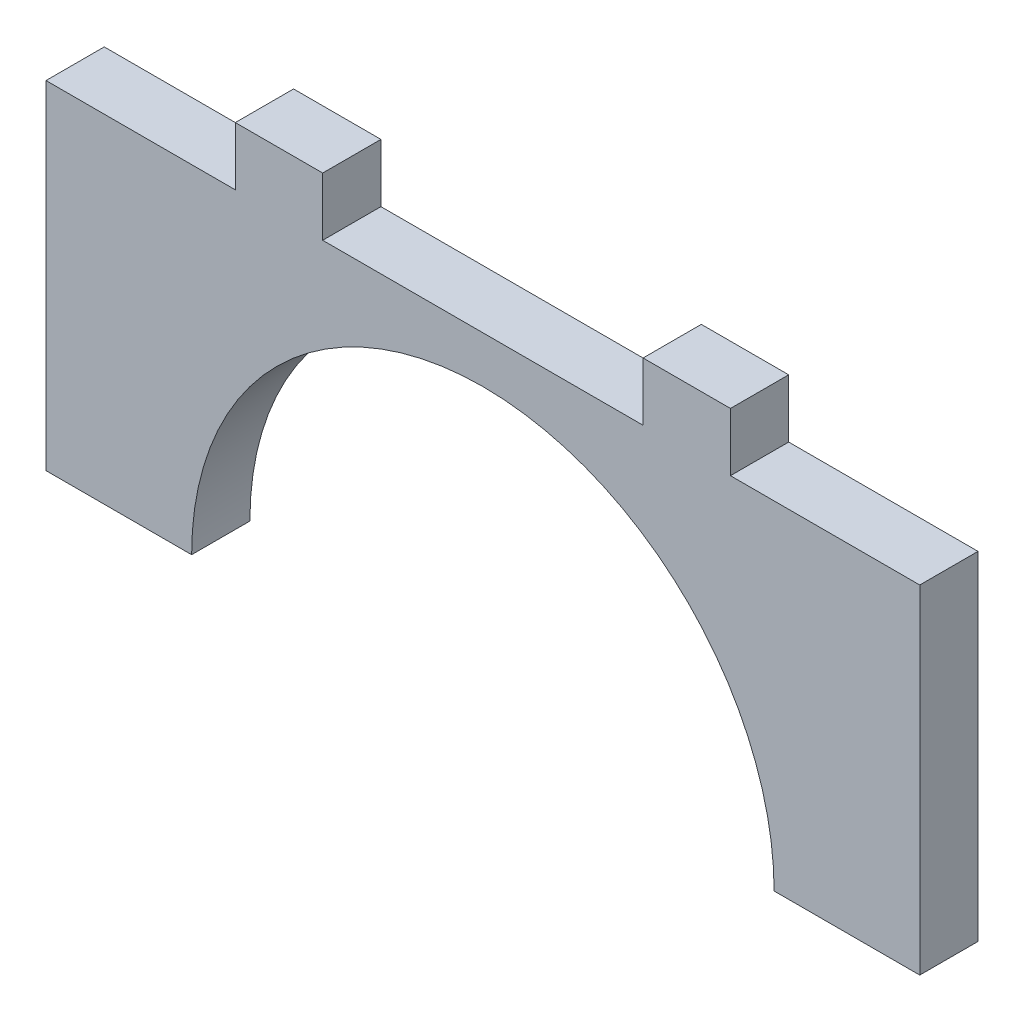
ISO-10303-21;
HEADER;
FILE_DESCRIPTION(('STEP AP214'),'2;1');
FILE_NAME('part.step','',(''),(''),'','','');
FILE_SCHEMA(('AUTOMOTIVE_DESIGN { 1 0 10303 214 1 1 1 1 }'));
ENDSEC;
DATA;
#1=APPLICATION_CONTEXT('core data for automotive mechanical design processes');
#2=APPLICATION_PROTOCOL_DEFINITION('international standard','automotive_design',2000,#1);
#3=PRODUCT_CONTEXT('',#1,'mechanical');
#4=PRODUCT('Part','Part','',(#3));
#5=PRODUCT_RELATED_PRODUCT_CATEGORY('part','',(#4));
#6=PRODUCT_DEFINITION_FORMATION('','',#4);
#7=PRODUCT_DEFINITION_CONTEXT('part definition',#1,'design');
#8=PRODUCT_DEFINITION('design','',#6,#7);
#9=PRODUCT_DEFINITION_SHAPE('','',#8);
#10=(LENGTH_UNIT() NAMED_UNIT(*) SI_UNIT(.MILLI.,.METRE.));
#11=(NAMED_UNIT(*) PLANE_ANGLE_UNIT() SI_UNIT($,.RADIAN.));
#12=(NAMED_UNIT(*) SI_UNIT($,.STERADIAN.) SOLID_ANGLE_UNIT());
#13=UNCERTAINTY_MEASURE_WITH_UNIT(LENGTH_MEASURE(1.E-05),#10,'distance_accuracy_value','');
#14=(GEOMETRIC_REPRESENTATION_CONTEXT(3) GLOBAL_UNCERTAINTY_ASSIGNED_CONTEXT((#13)) GLOBAL_UNIT_ASSIGNED_CONTEXT((#10,
#11,#12)) REPRESENTATION_CONTEXT('',''));
#15=CARTESIAN_POINT('',(0.,0.,0.));
#16=DIRECTION('',(0.,0.,1.));
#17=DIRECTION('',(1.,0.,0.));
#18=AXIS2_PLACEMENT_3D('',#15,#16,#17);
#19=CARTESIAN_POINT('',(0.,142.24,-12.7));
#20=DIRECTION('',(0.,0.,1.));
#21=DIRECTION('',(1.,0.,0.));
#22=AXIS2_PLACEMENT_3D('',#19,#20,#21);
#23=CYLINDRICAL_SURFACE('',#22,63.5);
#24=CARTESIAN_POINT('',(0.,142.24,0.));
#25=DIRECTION('',(0.,0.,1.));
#26=DIRECTION('',(1.,0.,0.));
#27=AXIS2_PLACEMENT_3D('',#24,#25,#26);
#28=CIRCLE('',#27,63.5);
#29=CARTESIAN_POINT('',(63.5,142.24,0.));
#30=VERTEX_POINT('',#29);
#31=CARTESIAN_POINT('',(-63.5,142.24,0.));
#32=VERTEX_POINT('',#31);
#33=EDGE_CURVE('E167',#30,#32,#28,.T.);
#34=ORIENTED_EDGE('',*,*,#33,.T.);
#35=DIRECTION('',(0.,0.,1.));
#36=VECTOR('',#35,1.);
#37=CARTESIAN_POINT('',(-63.5,142.24,-12.7));
#38=LINE('',#37,#36);
#39=CARTESIAN_POINT('',(-63.5,142.24,-12.7));
#40=VERTEX_POINT('',#39);
#41=EDGE_CURVE('E11',#40,#32,#38,.T.);
#42=ORIENTED_EDGE('',*,*,#41,.F.);
#43=CARTESIAN_POINT('',(0.,142.24,-12.7));
#44=DIRECTION('',(0.,0.,1.));
#45=DIRECTION('',(1.,0.,0.));
#46=AXIS2_PLACEMENT_3D('',#43,#44,#45);
#47=CIRCLE('',#46,63.5);
#48=CARTESIAN_POINT('',(63.5,142.24,-12.7));
#49=VERTEX_POINT('',#48);
#50=EDGE_CURVE('E200',#49,#40,#47,.T.);
#51=ORIENTED_EDGE('',*,*,#50,.F.);
#52=DIRECTION('',(0.,0.,1.));
#53=VECTOR('',#52,1.);
#54=CARTESIAN_POINT('',(63.5,142.24,-12.7));
#55=LINE('',#54,#53);
#56=EDGE_CURVE('E38',#49,#30,#55,.T.);
#57=ORIENTED_EDGE('',*,*,#56,.T.);
#58=EDGE_LOOP('',(#34,#42,#51,#57));
#59=FACE_BOUND('',#58,.T.);
#60=ADVANCED_FACE('F35',(#59),#23,.F.);
#61=CARTESIAN_POINT('',(0.,142.24,-12.7));
#62=DIRECTION('',(0.,1.,0.));
#63=DIRECTION('',(0.,0.,1.));
#64=AXIS2_PLACEMENT_3D('',#61,#62,#63);
#65=PLANE('',#64);
#66=DIRECTION('',(-1.,0.,0.));
#67=VECTOR('',#66,1.);
#68=CARTESIAN_POINT('',(0.,142.24,0.));
#69=LINE('',#68,#67);
#70=CARTESIAN_POINT('',(-95.25,142.24,0.));
#71=VERTEX_POINT('',#70);
#72=EDGE_CURVE('E96',#32,#71,#69,.T.);
#73=ORIENTED_EDGE('',*,*,#72,.T.);
#74=DIRECTION('',(0.,0.,1.));
#75=VECTOR('',#74,1.);
#76=CARTESIAN_POINT('',(-95.25,142.24,-12.7));
#77=LINE('',#76,#75);
#78=CARTESIAN_POINT('',(-95.25,142.24,-12.7));
#79=VERTEX_POINT('',#78);
#80=EDGE_CURVE('E44',#79,#71,#77,.T.);
#81=ORIENTED_EDGE('',*,*,#80,.F.);
#82=DIRECTION('',(-1.,0.,0.));
#83=VECTOR('',#82,1.);
#84=CARTESIAN_POINT('',(0.,142.24,-12.7));
#85=LINE('',#84,#83);
#86=EDGE_CURVE('E52',#40,#79,#85,.T.);
#87=ORIENTED_EDGE('',*,*,#86,.F.);
#88=ORIENTED_EDGE('',*,*,#41,.T.);
#89=EDGE_LOOP('',(#73,#81,#87,#88));
#90=FACE_BOUND('',#89,.T.);
#91=ADVANCED_FACE('F288',(#90),#65,.F.);
#92=CARTESIAN_POINT('',(-95.25,0.,-12.7));
#93=DIRECTION('',(1.,0.,0.));
#94=DIRECTION('',(0.,0.,-1.));
#95=AXIS2_PLACEMENT_3D('',#92,#93,#94);
#96=PLANE('',#95);
#97=DIRECTION('',(0.,1.,0.));
#98=VECTOR('',#97,1.);
#99=CARTESIAN_POINT('',(-95.25,0.,0.));
#100=LINE('',#99,#98);
#101=CARTESIAN_POINT('',(-95.25,215.9,0.));
#102=VERTEX_POINT('',#101);
#103=EDGE_CURVE('E152',#71,#102,#100,.T.);
#104=ORIENTED_EDGE('',*,*,#103,.T.);
#105=DIRECTION('',(0.,0.,1.));
#106=VECTOR('',#105,1.);
#107=CARTESIAN_POINT('',(-95.25,215.9,-12.7));
#108=LINE('',#107,#106);
#109=CARTESIAN_POINT('',(-95.25,215.9,-12.7));
#110=VERTEX_POINT('',#109);
#111=EDGE_CURVE('E150',#110,#102,#108,.T.);
#112=ORIENTED_EDGE('',*,*,#111,.F.);
#113=DIRECTION('',(0.,1.,0.));
#114=VECTOR('',#113,1.);
#115=CARTESIAN_POINT('',(-95.25,0.,-12.7));
#116=LINE('',#115,#114);
#117=EDGE_CURVE('E142',#79,#110,#116,.T.);
#118=ORIENTED_EDGE('',*,*,#117,.F.);
#119=ORIENTED_EDGE('',*,*,#80,.T.);
#120=EDGE_LOOP('',(#104,#112,#118,#119));
#121=FACE_BOUND('',#120,.T.);
#122=ADVANCED_FACE('F151',(#121),#96,.F.);
#123=CARTESIAN_POINT('',(0.,215.9,-12.7));
#124=DIRECTION('',(0.,1.,0.));
#125=DIRECTION('',(0.,0.,1.));
#126=AXIS2_PLACEMENT_3D('',#123,#124,#125);
#127=PLANE('',#126);
#128=DIRECTION('',(-1.,0.,0.));
#129=VECTOR('',#128,1.);
#130=CARTESIAN_POINT('',(0.,215.9,0.));
#131=LINE('',#130,#129);
#132=CARTESIAN_POINT('',(-53.975,215.9,0.));
#133=VERTEX_POINT('',#132);
#134=EDGE_CURVE('E197',#133,#102,#131,.T.);
#135=ORIENTED_EDGE('',*,*,#134,.F.);
#136=DIRECTION('',(0.,0.,1.));
#137=VECTOR('',#136,1.);
#138=CARTESIAN_POINT('',(-53.975,215.9,-12.7));
#139=LINE('',#138,#137);
#140=CARTESIAN_POINT('',(-53.975,215.9,-12.7));
#141=VERTEX_POINT('',#140);
#142=EDGE_CURVE('E156',#141,#133,#139,.T.);
#143=ORIENTED_EDGE('',*,*,#142,.F.);
#144=DIRECTION('',(-1.,0.,0.));
#145=VECTOR('',#144,1.);
#146=CARTESIAN_POINT('',(0.,215.9,-12.7));
#147=LINE('',#146,#145);
#148=EDGE_CURVE('E146',#141,#110,#147,.T.);
#149=ORIENTED_EDGE('',*,*,#148,.T.);
#150=ORIENTED_EDGE('',*,*,#111,.T.);
#151=EDGE_LOOP('',(#135,#143,#149,#150));
#152=FACE_BOUND('',#151,.T.);
#153=ADVANCED_FACE('F158',(#152),#127,.T.);
#154=CARTESIAN_POINT('',(-53.9749999999999,0.,-12.7));
#155=DIRECTION('',(1.,0.,0.));
#156=DIRECTION('',(0.,1.,0.));
#157=AXIS2_PLACEMENT_3D('',#154,#155,#156);
#158=PLANE('',#157);
#159=DIRECTION('',(0.,1.,0.));
#160=VECTOR('',#159,1.);
#161=CARTESIAN_POINT('',(-53.9749999999999,0.,0.));
#162=LINE('',#161,#160);
#163=CARTESIAN_POINT('',(-53.975,228.6,0.));
#164=VERTEX_POINT('',#163);
#165=EDGE_CURVE('E195',#133,#164,#162,.T.);
#166=ORIENTED_EDGE('',*,*,#165,.T.);
#167=DIRECTION('',(0.,0.,1.));
#168=VECTOR('',#167,1.);
#169=CARTESIAN_POINT('',(-53.975,228.6,-12.7));
#170=LINE('',#169,#168);
#171=CARTESIAN_POINT('',(-53.975,228.6,-12.7));
#172=VERTEX_POINT('',#171);
#173=EDGE_CURVE('E204',#172,#164,#170,.T.);
#174=ORIENTED_EDGE('',*,*,#173,.F.);
#175=DIRECTION('',(0.,1.,0.));
#176=VECTOR('',#175,1.);
#177=CARTESIAN_POINT('',(-53.9749999999999,0.,-12.7));
#178=LINE('',#177,#176);
#179=EDGE_CURVE('E160',#141,#172,#178,.T.);
#180=ORIENTED_EDGE('',*,*,#179,.F.);
#181=ORIENTED_EDGE('',*,*,#142,.T.);
#182=EDGE_LOOP('',(#166,#174,#180,#181));
#183=FACE_BOUND('',#182,.T.);
#184=ADVANCED_FACE('F276',(#183),#158,.F.);
#185=CARTESIAN_POINT('',(0.,228.6,-12.7));
#186=DIRECTION('',(0.,-1.,0.));
#187=DIRECTION('',(0.,0.,-1.));
#188=AXIS2_PLACEMENT_3D('',#185,#186,#187);
#189=PLANE('',#188);
#190=DIRECTION('',(1.,0.,0.));
#191=VECTOR('',#190,1.);
#192=CARTESIAN_POINT('',(0.,228.6,0.));
#193=LINE('',#192,#191);
#194=CARTESIAN_POINT('',(-34.925,228.6,0.));
#195=VERTEX_POINT('',#194);
#196=EDGE_CURVE('E192',#164,#195,#193,.T.);
#197=ORIENTED_EDGE('',*,*,#196,.T.);
#198=DIRECTION('',(0.,0.,1.));
#199=VECTOR('',#198,1.);
#200=CARTESIAN_POINT('',(-34.925,228.6,-12.7));
#201=LINE('',#200,#199);
#202=CARTESIAN_POINT('',(-34.925,228.6,-12.7));
#203=VERTEX_POINT('',#202);
#204=EDGE_CURVE('E207',#203,#195,#201,.T.);
#205=ORIENTED_EDGE('',*,*,#204,.F.);
#206=DIRECTION('',(1.,0.,0.));
#207=VECTOR('',#206,1.);
#208=CARTESIAN_POINT('',(0.,228.6,-12.7));
#209=LINE('',#208,#207);
#210=EDGE_CURVE('E162',#172,#203,#209,.T.);
#211=ORIENTED_EDGE('',*,*,#210,.F.);
#212=ORIENTED_EDGE('',*,*,#173,.T.);
#213=EDGE_LOOP('',(#197,#205,#211,#212));
#214=FACE_BOUND('',#213,.T.);
#215=ADVANCED_FACE('F272',(#214),#189,.F.);
#216=CARTESIAN_POINT('',(-34.925,0.,-12.7));
#217=DIRECTION('',(1.,0.,0.));
#218=DIRECTION('',(0.,0.,-1.));
#219=AXIS2_PLACEMENT_3D('',#216,#217,#218);
#220=PLANE('',#219);
#221=DIRECTION('',(0.,1.,0.));
#222=VECTOR('',#221,1.);
#223=CARTESIAN_POINT('',(-34.925,0.,0.));
#224=LINE('',#223,#222);
#225=CARTESIAN_POINT('',(-34.925,215.9,0.));
#226=VERTEX_POINT('',#225);
#227=EDGE_CURVE('E189',#226,#195,#224,.T.);
#228=ORIENTED_EDGE('',*,*,#227,.F.);
#229=DIRECTION('',(0.,0.,1.));
#230=VECTOR('',#229,1.);
#231=CARTESIAN_POINT('',(-34.925,215.9,-12.7));
#232=LINE('',#231,#230);
#233=CARTESIAN_POINT('',(-34.925,215.9,-12.7));
#234=VERTEX_POINT('',#233);
#235=EDGE_CURVE('E209',#234,#226,#232,.T.);
#236=ORIENTED_EDGE('',*,*,#235,.F.);
#237=DIRECTION('',(0.,1.,0.));
#238=VECTOR('',#237,1.);
#239=CARTESIAN_POINT('',(-34.925,0.,-12.7));
#240=LINE('',#239,#238);
#241=EDGE_CURVE('E277',#234,#203,#240,.T.);
#242=ORIENTED_EDGE('',*,*,#241,.T.);
#243=ORIENTED_EDGE('',*,*,#204,.T.);
#244=EDGE_LOOP('',(#228,#236,#242,#243));
#245=FACE_BOUND('',#244,.T.);
#246=ADVANCED_FACE('F267',(#245),#220,.T.);
#247=CARTESIAN_POINT('',(0.,215.9,-12.7));
#248=DIRECTION('',(0.,1.,0.));
#249=DIRECTION('',(0.,0.,1.));
#250=AXIS2_PLACEMENT_3D('',#247,#248,#249);
#251=PLANE('',#250);
#252=DIRECTION('',(-1.,0.,0.));
#253=VECTOR('',#252,1.);
#254=CARTESIAN_POINT('',(0.,215.9,0.));
#255=LINE('',#254,#253);
#256=CARTESIAN_POINT('',(34.925,215.9,0.));
#257=VERTEX_POINT('',#256);
#258=EDGE_CURVE('E186',#257,#226,#255,.T.);
#259=ORIENTED_EDGE('',*,*,#258,.F.);
#260=DIRECTION('',(0.,0.,1.));
#261=VECTOR('',#260,1.);
#262=CARTESIAN_POINT('',(34.925,215.9,-12.7));
#263=LINE('',#262,#261);
#264=CARTESIAN_POINT('',(34.925,215.9,-12.7));
#265=VERTEX_POINT('',#264);
#266=EDGE_CURVE('E211',#265,#257,#263,.T.);
#267=ORIENTED_EDGE('',*,*,#266,.F.);
#268=DIRECTION('',(-1.,0.,0.));
#269=VECTOR('',#268,1.);
#270=CARTESIAN_POINT('',(0.,215.9,-12.7));
#271=LINE('',#270,#269);
#272=EDGE_CURVE('E263',#265,#234,#271,.T.);
#273=ORIENTED_EDGE('',*,*,#272,.T.);
#274=ORIENTED_EDGE('',*,*,#235,.T.);
#275=EDGE_LOOP('',(#259,#267,#273,#274));
#276=FACE_BOUND('',#275,.T.);
#277=ADVANCED_FACE('F260',(#276),#251,.T.);
#278=CARTESIAN_POINT('',(34.925,0.,-12.7));
#279=DIRECTION('',(1.,0.,0.));
#280=DIRECTION('',(0.,0.,-1.));
#281=AXIS2_PLACEMENT_3D('',#278,#279,#280);
#282=PLANE('',#281);
#283=DIRECTION('',(0.,1.,0.));
#284=VECTOR('',#283,1.);
#285=CARTESIAN_POINT('',(34.925,0.,0.));
#286=LINE('',#285,#284);
#287=CARTESIAN_POINT('',(34.925,228.6,0.));
#288=VERTEX_POINT('',#287);
#289=EDGE_CURVE('E184',#257,#288,#286,.T.);
#290=ORIENTED_EDGE('',*,*,#289,.T.);
#291=DIRECTION('',(0.,0.,1.));
#292=VECTOR('',#291,1.);
#293=CARTESIAN_POINT('',(34.925,228.6,-12.7));
#294=LINE('',#293,#292);
#295=CARTESIAN_POINT('',(34.925,228.6,-12.7));
#296=VERTEX_POINT('',#295);
#297=EDGE_CURVE('E213',#296,#288,#294,.T.);
#298=ORIENTED_EDGE('',*,*,#297,.F.);
#299=DIRECTION('',(0.,1.,0.));
#300=VECTOR('',#299,1.);
#301=CARTESIAN_POINT('',(34.925,0.,-12.7));
#302=LINE('',#301,#300);
#303=EDGE_CURVE('E256',#265,#296,#302,.T.);
#304=ORIENTED_EDGE('',*,*,#303,.F.);
#305=ORIENTED_EDGE('',*,*,#266,.T.);
#306=EDGE_LOOP('',(#290,#298,#304,#305));
#307=FACE_BOUND('',#306,.T.);
#308=ADVANCED_FACE('F255',(#307),#282,.F.);
#309=CARTESIAN_POINT('',(0.,228.6,-12.7));
#310=DIRECTION('',(0.,-1.,0.));
#311=DIRECTION('',(0.,0.,-1.));
#312=AXIS2_PLACEMENT_3D('',#309,#310,#311);
#313=PLANE('',#312);
#314=DIRECTION('',(1.,0.,0.));
#315=VECTOR('',#314,1.);
#316=CARTESIAN_POINT('',(0.,228.6,0.));
#317=LINE('',#316,#315);
#318=CARTESIAN_POINT('',(53.975,228.6,0.));
#319=VERTEX_POINT('',#318);
#320=EDGE_CURVE('E181',#288,#319,#317,.T.);
#321=ORIENTED_EDGE('',*,*,#320,.T.);
#322=DIRECTION('',(0.,0.,1.));
#323=VECTOR('',#322,1.);
#324=CARTESIAN_POINT('',(53.975,228.6,-12.7));
#325=LINE('',#324,#323);
#326=CARTESIAN_POINT('',(53.975,228.6,-12.7));
#327=VERTEX_POINT('',#326);
#328=EDGE_CURVE('E216',#327,#319,#325,.T.);
#329=ORIENTED_EDGE('',*,*,#328,.F.);
#330=DIRECTION('',(1.,0.,0.));
#331=VECTOR('',#330,1.);
#332=CARTESIAN_POINT('',(0.,228.6,-12.7));
#333=LINE('',#332,#331);
#334=EDGE_CURVE('E252',#296,#327,#333,.T.);
#335=ORIENTED_EDGE('',*,*,#334,.F.);
#336=ORIENTED_EDGE('',*,*,#297,.T.);
#337=EDGE_LOOP('',(#321,#329,#335,#336));
#338=FACE_BOUND('',#337,.T.);
#339=ADVANCED_FACE('F250',(#338),#313,.F.);
#340=CARTESIAN_POINT('',(53.975,0.,-12.7));
#341=DIRECTION('',(1.,0.,0.));
#342=DIRECTION('',(0.,0.,-1.));
#343=AXIS2_PLACEMENT_3D('',#340,#341,#342);
#344=PLANE('',#343);
#345=DIRECTION('',(0.,1.,0.));
#346=VECTOR('',#345,1.);
#347=CARTESIAN_POINT('',(53.975,0.,0.));
#348=LINE('',#347,#346);
#349=CARTESIAN_POINT('',(53.975,215.9,0.));
#350=VERTEX_POINT('',#349);
#351=EDGE_CURVE('E178',#350,#319,#348,.T.);
#352=ORIENTED_EDGE('',*,*,#351,.F.);
#353=DIRECTION('',(0.,0.,1.));
#354=VECTOR('',#353,1.);
#355=CARTESIAN_POINT('',(53.975,215.9,-12.7));
#356=LINE('',#355,#354);
#357=CARTESIAN_POINT('',(53.975,215.9,-12.7));
#358=VERTEX_POINT('',#357);
#359=EDGE_CURVE('E218',#358,#350,#356,.T.);
#360=ORIENTED_EDGE('',*,*,#359,.F.);
#361=DIRECTION('',(0.,1.,0.));
#362=VECTOR('',#361,1.);
#363=CARTESIAN_POINT('',(53.975,0.,-12.7));
#364=LINE('',#363,#362);
#365=EDGE_CURVE('E247',#358,#327,#364,.T.);
#366=ORIENTED_EDGE('',*,*,#365,.T.);
#367=ORIENTED_EDGE('',*,*,#328,.T.);
#368=EDGE_LOOP('',(#352,#360,#366,#367));
#369=FACE_BOUND('',#368,.T.);
#370=ADVANCED_FACE('F243',(#369),#344,.T.);
#371=CARTESIAN_POINT('',(0.,215.9,-12.7));
#372=DIRECTION('',(0.,1.,0.));
#373=DIRECTION('',(0.,0.,1.));
#374=AXIS2_PLACEMENT_3D('',#371,#372,#373);
#375=PLANE('',#374);
#376=DIRECTION('',(-1.,0.,0.));
#377=VECTOR('',#376,1.);
#378=CARTESIAN_POINT('',(0.,215.9,0.));
#379=LINE('',#378,#377);
#380=CARTESIAN_POINT('',(95.25,215.9,0.));
#381=VERTEX_POINT('',#380);
#382=EDGE_CURVE('E175',#381,#350,#379,.T.);
#383=ORIENTED_EDGE('',*,*,#382,.F.);
#384=DIRECTION('',(0.,0.,1.));
#385=VECTOR('',#384,1.);
#386=CARTESIAN_POINT('',(95.25,215.9,-12.7));
#387=LINE('',#386,#385);
#388=CARTESIAN_POINT('',(95.25,215.9,-12.7));
#389=VERTEX_POINT('',#388);
#390=EDGE_CURVE('E220',#389,#381,#387,.T.);
#391=ORIENTED_EDGE('',*,*,#390,.F.);
#392=DIRECTION('',(-1.,0.,0.));
#393=VECTOR('',#392,1.);
#394=CARTESIAN_POINT('',(0.,215.9,-12.7));
#395=LINE('',#394,#393);
#396=EDGE_CURVE('E284',#389,#358,#395,.T.);
#397=ORIENTED_EDGE('',*,*,#396,.T.);
#398=ORIENTED_EDGE('',*,*,#359,.T.);
#399=EDGE_LOOP('',(#383,#391,#397,#398));
#400=FACE_BOUND('',#399,.T.);
#401=ADVANCED_FACE('F238',(#400),#375,.T.);
#402=CARTESIAN_POINT('',(95.2499999999999,0.,-12.7));
#403=DIRECTION('',(1.,0.,0.));
#404=DIRECTION('',(0.,1.,0.));
#405=AXIS2_PLACEMENT_3D('',#402,#403,#404);
#406=PLANE('',#405);
#407=DIRECTION('',(0.,1.,0.));
#408=VECTOR('',#407,1.);
#409=CARTESIAN_POINT('',(95.2499999999999,0.,0.));
#410=LINE('',#409,#408);
#411=CARTESIAN_POINT('',(95.25,142.24,0.));
#412=VERTEX_POINT('',#411);
#413=EDGE_CURVE('E172',#412,#381,#410,.T.);
#414=ORIENTED_EDGE('',*,*,#413,.F.);
#415=DIRECTION('',(0.,0.,1.));
#416=VECTOR('',#415,1.);
#417=CARTESIAN_POINT('',(95.25,142.24,-12.7));
#418=LINE('',#417,#416);
#419=CARTESIAN_POINT('',(95.25,142.24,-12.7));
#420=VERTEX_POINT('',#419);
#421=EDGE_CURVE('E221',#420,#412,#418,.T.);
#422=ORIENTED_EDGE('',*,*,#421,.F.);
#423=DIRECTION('',(0.,1.,0.));
#424=VECTOR('',#423,1.);
#425=CARTESIAN_POINT('',(95.2499999999999,0.,-12.7));
#426=LINE('',#425,#424);
#427=EDGE_CURVE('E234',#420,#389,#426,.T.);
#428=ORIENTED_EDGE('',*,*,#427,.T.);
#429=ORIENTED_EDGE('',*,*,#390,.T.);
#430=EDGE_LOOP('',(#414,#422,#428,#429));
#431=FACE_BOUND('',#430,.T.);
#432=ADVANCED_FACE('F231',(#431),#406,.T.);
#433=CARTESIAN_POINT('',(0.,142.24,-12.7));
#434=DIRECTION('',(0.,1.,0.));
#435=DIRECTION('',(0.,0.,1.));
#436=AXIS2_PLACEMENT_3D('',#433,#434,#435);
#437=PLANE('',#436);
#438=DIRECTION('',(-1.,0.,0.));
#439=VECTOR('',#438,1.);
#440=CARTESIAN_POINT('',(0.,142.24,0.));
#441=LINE('',#440,#439);
#442=EDGE_CURVE('E170',#412,#30,#441,.T.);
#443=ORIENTED_EDGE('',*,*,#442,.T.);
#444=ORIENTED_EDGE('',*,*,#56,.F.);
#445=DIRECTION('',(-1.,0.,0.));
#446=VECTOR('',#445,1.);
#447=CARTESIAN_POINT('',(0.,142.24,-12.7));
#448=LINE('',#447,#446);
#449=EDGE_CURVE('E108',#420,#49,#448,.T.);
#450=ORIENTED_EDGE('',*,*,#449,.F.);
#451=ORIENTED_EDGE('',*,*,#421,.T.);
#452=EDGE_LOOP('',(#443,#444,#450,#451));
#453=FACE_BOUND('',#452,.T.);
#454=ADVANCED_FACE('F318',(#453),#437,.F.);
#455=CARTESIAN_POINT('',(0.,0.,-12.7));
#456=DIRECTION('',(0.,0.,1.));
#457=DIRECTION('',(1.,0.,0.));
#458=AXIS2_PLACEMENT_3D('',#455,#456,#457);
#459=PLANE('',#458);
#460=ORIENTED_EDGE('',*,*,#50,.T.);
#461=ORIENTED_EDGE('',*,*,#86,.T.);
#462=ORIENTED_EDGE('',*,*,#117,.T.);
#463=ORIENTED_EDGE('',*,*,#148,.F.);
#464=ORIENTED_EDGE('',*,*,#179,.T.);
#465=ORIENTED_EDGE('',*,*,#210,.T.);
#466=ORIENTED_EDGE('',*,*,#241,.F.);
#467=ORIENTED_EDGE('',*,*,#272,.F.);
#468=ORIENTED_EDGE('',*,*,#303,.T.);
#469=ORIENTED_EDGE('',*,*,#334,.T.);
#470=ORIENTED_EDGE('',*,*,#365,.F.);
#471=ORIENTED_EDGE('',*,*,#396,.F.);
#472=ORIENTED_EDGE('',*,*,#427,.F.);
#473=ORIENTED_EDGE('',*,*,#449,.T.);
#474=EDGE_LOOP('',(#460,#461,#462,#463,#464,#465,#466,#467,#468,#469,#470,#471,#472,#473));
#475=FACE_BOUND('',#474,.T.);
#476=ADVANCED_FACE('F144',(#475),#459,.F.);
#477=CARTESIAN_POINT('',(0.,0.,0.));
#478=DIRECTION('',(0.,0.,1.));
#479=DIRECTION('',(1.,0.,0.));
#480=AXIS2_PLACEMENT_3D('',#477,#478,#479);
#481=PLANE('',#480);
#482=ORIENTED_EDGE('',*,*,#33,.F.);
#483=ORIENTED_EDGE('',*,*,#442,.F.);
#484=ORIENTED_EDGE('',*,*,#413,.T.);
#485=ORIENTED_EDGE('',*,*,#382,.T.);
#486=ORIENTED_EDGE('',*,*,#351,.T.);
#487=ORIENTED_EDGE('',*,*,#320,.F.);
#488=ORIENTED_EDGE('',*,*,#289,.F.);
#489=ORIENTED_EDGE('',*,*,#258,.T.);
#490=ORIENTED_EDGE('',*,*,#227,.T.);
#491=ORIENTED_EDGE('',*,*,#196,.F.);
#492=ORIENTED_EDGE('',*,*,#165,.F.);
#493=ORIENTED_EDGE('',*,*,#134,.T.);
#494=ORIENTED_EDGE('',*,*,#103,.F.);
#495=ORIENTED_EDGE('',*,*,#72,.F.);
#496=EDGE_LOOP('',(#482,#483,#484,#485,#486,#487,#488,#489,#490,#491,#492,#493,#494,#495));
#497=FACE_BOUND('',#496,.T.);
#498=ADVANCED_FACE('F228',(#497),#481,.T.);
#499=CLOSED_SHELL('',(#60,#91,#122,#153,#184,#215,#246,#277,#308,#339,#370,#401,#432,#454,#476,#498));
#500=MANIFOLD_SOLID_BREP('B2',#499);
#501=ADVANCED_BREP_SHAPE_REPRESENTATION('',(#18,#500),#14);
#502=SHAPE_DEFINITION_REPRESENTATION(#9,#501);
ENDSEC;
END-ISO-10303-21;
